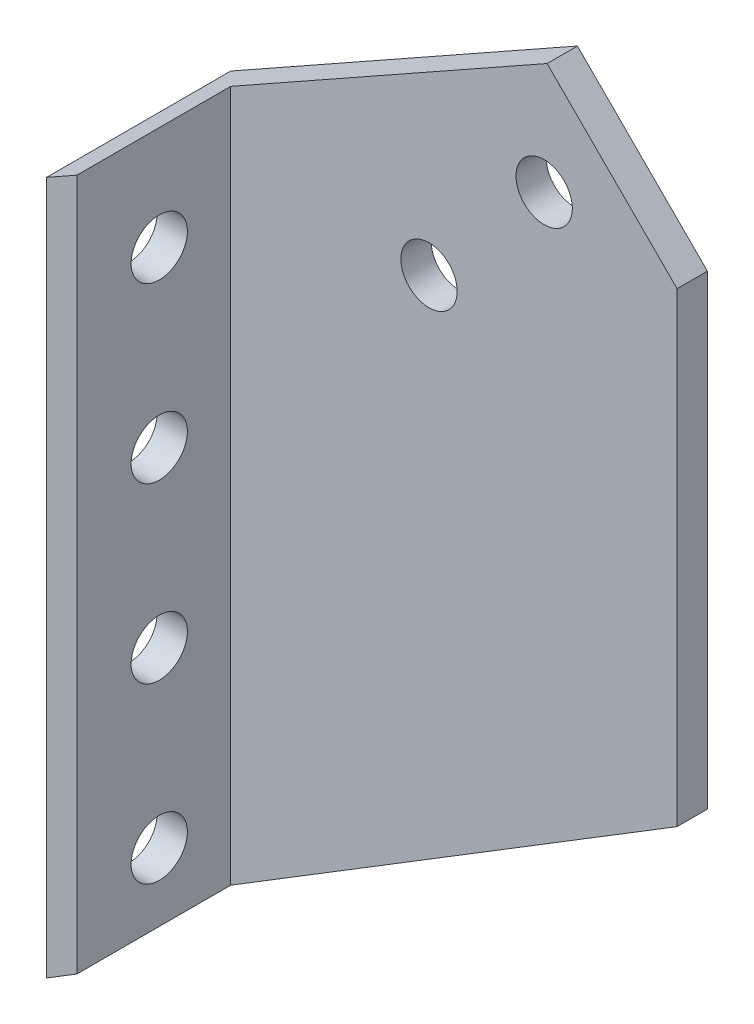
ISO-10303-21;
HEADER;
FILE_DESCRIPTION(('STEP AP214'),'2;1');
FILE_NAME('part.step','',(''),(''),'','','');
FILE_SCHEMA(('AUTOMOTIVE_DESIGN { 1 0 10303 214 1 1 1 1 }'));
ENDSEC;
DATA;
#1=APPLICATION_CONTEXT('core data for automotive mechanical design processes');
#2=APPLICATION_PROTOCOL_DEFINITION('international standard','automotive_design',2000,#1);
#3=PRODUCT_CONTEXT('',#1,'mechanical');
#4=PRODUCT('Part','Part','',(#3));
#5=PRODUCT_RELATED_PRODUCT_CATEGORY('part','',(#4));
#6=PRODUCT_DEFINITION_FORMATION('','',#4);
#7=PRODUCT_DEFINITION_CONTEXT('part definition',#1,'design');
#8=PRODUCT_DEFINITION('design','',#6,#7);
#9=PRODUCT_DEFINITION_SHAPE('','',#8);
#10=(LENGTH_UNIT() NAMED_UNIT(*) SI_UNIT(.MILLI.,.METRE.));
#11=(NAMED_UNIT(*) PLANE_ANGLE_UNIT() SI_UNIT($,.RADIAN.));
#12=(NAMED_UNIT(*) SI_UNIT($,.STERADIAN.) SOLID_ANGLE_UNIT());
#13=UNCERTAINTY_MEASURE_WITH_UNIT(LENGTH_MEASURE(1.E-05),#10,'distance_accuracy_value','');
#14=(GEOMETRIC_REPRESENTATION_CONTEXT(3) GLOBAL_UNCERTAINTY_ASSIGNED_CONTEXT((#13)) GLOBAL_UNIT_ASSIGNED_CONTEXT((#10,
#11,#12)) REPRESENTATION_CONTEXT('',''));
#15=CARTESIAN_POINT('',(0.,0.,0.));
#16=DIRECTION('',(0.,0.,1.));
#17=DIRECTION('',(1.,0.,0.));
#18=AXIS2_PLACEMENT_3D('',#15,#16,#17);
#19=CARTESIAN_POINT('',(233.582996255987,153.383897007896,14.));
#20=DIRECTION('',(0.,0.,1.));
#21=DIRECTION('',(1.,0.,0.));
#22=AXIS2_PLACEMENT_3D('',#19,#20,#21);
#23=PLANE('',#22);
#24=DIRECTION('',(0.,1.,0.));
#25=VECTOR('',#24,1.);
#26=CARTESIAN_POINT('',(-105.656440363729,264.498333627615,14.));
#27=LINE('',#26,#25);
#28=CARTESIAN_POINT('',(-105.656440363729,-54.7857572814754,14.));
#29=VERTEX_POINT('',#28);
#30=CARTESIAN_POINT('',(-105.656440363729,264.498333627615,14.));
#31=VERTEX_POINT('',#30);
#32=EDGE_CURVE('E51',#29,#31,#27,.T.);
#33=ORIENTED_EDGE('',*,*,#32,.F.);
#34=DIRECTION('',(0.852322728648666,0.52301621985259,0.));
#35=VECTOR('',#34,1.);
#36=CARTESIAN_POINT('',(-119.656440363729,-63.3766663723846,14.));
#37=LINE('',#36,#35);
#38=CARTESIAN_POINT('',(100.343559636271,71.6233336276154,14.));
#39=VERTEX_POINT('',#38);
#40=EDGE_CURVE('E84',#29,#39,#37,.T.);
#41=ORIENTED_EDGE('',*,*,#40,.T.);
#42=DIRECTION('',(0.,1.,0.));
#43=VECTOR('',#42,1.);
#44=CARTESIAN_POINT('',(100.343559636271,71.6233336276154,14.));
#45=LINE('',#44,#43);
#46=CARTESIAN_POINT('',(100.343559636271,286.623333627615,14.));
#47=VERTEX_POINT('',#46);
#48=EDGE_CURVE('E201',#39,#47,#45,.T.);
#49=ORIENTED_EDGE('',*,*,#48,.T.);
#50=DIRECTION('',(-0.70710678118654,0.707106781186555,0.));
#51=VECTOR('',#50,1.);
#52=CARTESIAN_POINT('',(100.343559636271,286.623333627615,14.));
#53=LINE('',#52,#51);
#54=CARTESIAN_POINT('',(40.3435596362774,346.62333362761,14.));
#55=VERTEX_POINT('',#54);
#56=EDGE_CURVE('E58',#47,#55,#53,.T.);
#57=ORIENTED_EDGE('',*,*,#56,.T.);
#58=DIRECTION('',(-0.87157553712457,-0.490261239632521,0.));
#59=VECTOR('',#58,1.);
#60=CARTESIAN_POINT('',(40.3435596362774,346.62333362761,14.));
#61=LINE('',#60,#59);
#62=EDGE_CURVE('E139',#55,#31,#61,.T.);
#63=ORIENTED_EDGE('',*,*,#62,.T.);
#64=EDGE_LOOP('',(#33,#41,#49,#57,#63));
#65=FACE_BOUND('',#64,.T.);
#66=CARTESIAN_POINT('',(-14.1564403637289,234.748333627631,14.));
#67=DIRECTION('',(0.,0.,1.));
#68=DIRECTION('',(1.,0.,0.));
#69=AXIS2_PLACEMENT_3D('',#66,#67,#68);
#70=CIRCLE('',#69,13.);
#71=CARTESIAN_POINT('',(-1.15644036372886,234.748333627631,14.));
#72=VERTEX_POINT('',#71);
#73=EDGE_CURVE('E211',#72,#72,#70,.T.);
#74=ORIENTED_EDGE('',*,*,#73,.F.);
#75=EDGE_LOOP('',(#74));
#76=FACE_BOUND('',#75,.T.);
#77=CARTESIAN_POINT('',(38.9926667426649,294.541079122324,14.));
#78=DIRECTION('',(0.,0.,1.));
#79=DIRECTION('',(1.,0.,0.));
#80=AXIS2_PLACEMENT_3D('',#77,#78,#79);
#81=CIRCLE('',#80,13.);
#82=CARTESIAN_POINT('',(51.9926667426649,294.541079122324,14.));
#83=VERTEX_POINT('',#82);
#84=EDGE_CURVE('E135',#83,#83,#81,.T.);
#85=ORIENTED_EDGE('',*,*,#84,.F.);
#86=EDGE_LOOP('',(#85));
#87=FACE_BOUND('',#86,.T.);
#88=ADVANCED_FACE('F34',(#65,#76,#87),#23,.T.);
#89=CARTESIAN_POINT('',(233.582996255987,153.383897007896,0.));
#90=DIRECTION('',(0.,0.,1.));
#91=DIRECTION('',(1.,0.,0.));
#92=AXIS2_PLACEMENT_3D('',#89,#90,#91);
#93=PLANE('',#92);
#94=CARTESIAN_POINT('',(-14.1564403637289,234.748333627631,0.));
#95=DIRECTION('',(0.,0.,1.));
#96=DIRECTION('',(1.,0.,0.));
#97=AXIS2_PLACEMENT_3D('',#94,#95,#96);
#98=CIRCLE('',#97,13.);
#99=CARTESIAN_POINT('',(-1.15644036372886,234.748333627631,0.));
#100=VERTEX_POINT('',#99);
#101=EDGE_CURVE('E221',#100,#100,#98,.T.);
#102=ORIENTED_EDGE('',*,*,#101,.T.);
#103=EDGE_LOOP('',(#102));
#104=FACE_BOUND('',#103,.T.);
#105=DIRECTION('',(0.852322728648666,0.52301621985259,0.));
#106=VECTOR('',#105,1.);
#107=CARTESIAN_POINT('',(-119.656440363729,-63.3766663723846,0.));
#108=LINE('',#107,#106);
#109=CARTESIAN_POINT('',(-119.656440363729,-63.3766663723846,0.));
#110=VERTEX_POINT('',#109);
#111=CARTESIAN_POINT('',(100.343559636271,71.6233336276154,0.));
#112=VERTEX_POINT('',#111);
#113=EDGE_CURVE('E207',#110,#112,#108,.T.);
#114=ORIENTED_EDGE('',*,*,#113,.F.);
#115=DIRECTION('',(0.,-1.,0.));
#116=VECTOR('',#115,1.);
#117=CARTESIAN_POINT('',(-119.656440363729,-63.3766663723846,0.));
#118=LINE('',#117,#116);
#119=CARTESIAN_POINT('',(-119.656440363729,256.623333627615,0.));
#120=VERTEX_POINT('',#119);
#121=EDGE_CURVE('E82',#120,#110,#118,.T.);
#122=ORIENTED_EDGE('',*,*,#121,.F.);
#123=DIRECTION('',(-0.87157553712457,-0.490261239632521,0.));
#124=VECTOR('',#123,1.);
#125=CARTESIAN_POINT('',(40.3435596362774,346.62333362761,0.));
#126=LINE('',#125,#124);
#127=CARTESIAN_POINT('',(40.3435596362774,346.62333362761,0.));
#128=VERTEX_POINT('',#127);
#129=EDGE_CURVE('E108',#128,#120,#126,.T.);
#130=ORIENTED_EDGE('',*,*,#129,.F.);
#131=DIRECTION('',(-0.70710678118654,0.707106781186555,0.));
#132=VECTOR('',#131,1.);
#133=CARTESIAN_POINT('',(100.343559636271,286.623333627615,0.));
#134=LINE('',#133,#132);
#135=CARTESIAN_POINT('',(100.343559636271,286.623333627615,0.));
#136=VERTEX_POINT('',#135);
#137=EDGE_CURVE('E213',#136,#128,#134,.T.);
#138=ORIENTED_EDGE('',*,*,#137,.F.);
#139=DIRECTION('',(0.,1.,0.));
#140=VECTOR('',#139,1.);
#141=CARTESIAN_POINT('',(100.343559636271,71.6233336276154,0.));
#142=LINE('',#141,#140);
#143=EDGE_CURVE('E210',#112,#136,#142,.T.);
#144=ORIENTED_EDGE('',*,*,#143,.F.);
#145=EDGE_LOOP('',(#114,#122,#130,#138,#144));
#146=FACE_BOUND('',#145,.T.);
#147=CARTESIAN_POINT('',(38.9926667426649,294.541079122324,0.));
#148=DIRECTION('',(0.,0.,1.));
#149=DIRECTION('',(1.,0.,0.));
#150=AXIS2_PLACEMENT_3D('',#147,#148,#149);
#151=CIRCLE('',#150,13.);
#152=CARTESIAN_POINT('',(51.9926667426649,294.541079122324,0.));
#153=VERTEX_POINT('',#152);
#154=EDGE_CURVE('E148',#153,#153,#151,.T.);
#155=ORIENTED_EDGE('',*,*,#154,.T.);
#156=EDGE_LOOP('',(#155));
#157=FACE_BOUND('',#156,.T.);
#158=ADVANCED_FACE('F234',(#104,#146,#157),#93,.F.);
#159=CARTESIAN_POINT('',(-119.656440363729,-63.3766663723846,14.));
#160=DIRECTION('',(-0.52301621985259,0.852322728648666,0.));
#161=DIRECTION('',(-0.852322728648666,-0.52301621985259,0.));
#162=AXIS2_PLACEMENT_3D('',#159,#160,#161);
#163=PLANE('',#162);
#164=ORIENTED_EDGE('',*,*,#113,.T.);
#165=DIRECTION('',(0.,0.,-1.));
#166=VECTOR('',#165,1.);
#167=CARTESIAN_POINT('',(100.343559636271,71.6233336276154,14.));
#168=LINE('',#167,#166);
#169=EDGE_CURVE('E11',#39,#112,#168,.T.);
#170=ORIENTED_EDGE('',*,*,#169,.F.);
#171=ORIENTED_EDGE('',*,*,#40,.F.);
#172=DIRECTION('',(0.,0.,-1.));
#173=VECTOR('',#172,1.);
#174=CARTESIAN_POINT('',(-105.656440363729,-54.7857572814754,85.));
#175=LINE('',#174,#173);
#176=CARTESIAN_POINT('',(-105.656440363729,-54.7857572814754,85.));
#177=VERTEX_POINT('',#176);
#178=EDGE_CURVE('E143',#177,#29,#175,.T.);
#179=ORIENTED_EDGE('',*,*,#178,.F.);
#180=DIRECTION('',(0.852322728648666,0.52301621985259,0.));
#181=VECTOR('',#180,1.);
#182=CARTESIAN_POINT('',(-119.656440363729,-63.3766663723846,85.));
#183=LINE('',#182,#181);
#184=CARTESIAN_POINT('',(-119.656440363729,-63.3766663723846,85.));
#185=VERTEX_POINT('',#184);
#186=EDGE_CURVE('E117',#185,#177,#183,.T.);
#187=ORIENTED_EDGE('',*,*,#186,.F.);
#188=DIRECTION('',(0.,0.,-1.));
#189=VECTOR('',#188,1.);
#190=CARTESIAN_POINT('',(-119.656440363729,-63.3766663723846,14.));
#191=LINE('',#190,#189);
#192=EDGE_CURVE('E110',#185,#110,#191,.T.);
#193=ORIENTED_EDGE('',*,*,#192,.T.);
#194=EDGE_LOOP('',(#164,#170,#171,#179,#187,#193));
#195=FACE_BOUND('',#194,.T.);
#196=ADVANCED_FACE('F36',(#195),#163,.F.);
#197=CARTESIAN_POINT('',(100.343559636271,71.6233336276154,14.));
#198=DIRECTION('',(-1.,0.,0.));
#199=DIRECTION('',(0.,0.,1.));
#200=AXIS2_PLACEMENT_3D('',#197,#198,#199);
#201=PLANE('',#200);
#202=ORIENTED_EDGE('',*,*,#143,.T.);
#203=DIRECTION('',(0.,0.,-1.));
#204=VECTOR('',#203,1.);
#205=CARTESIAN_POINT('',(100.343559636271,286.623333627615,14.));
#206=LINE('',#205,#204);
#207=EDGE_CURVE('E43',#47,#136,#206,.T.);
#208=ORIENTED_EDGE('',*,*,#207,.F.);
#209=ORIENTED_EDGE('',*,*,#48,.F.);
#210=ORIENTED_EDGE('',*,*,#169,.T.);
#211=EDGE_LOOP('',(#202,#208,#209,#210));
#212=FACE_BOUND('',#211,.T.);
#213=ADVANCED_FACE('F249',(#212),#201,.F.);
#214=CARTESIAN_POINT('',(100.343559636271,286.623333627615,14.));
#215=DIRECTION('',(-0.707106781186555,-0.70710678118654,0.));
#216=DIRECTION('',(0.70710678118654,-0.707106781186555,0.));
#217=AXIS2_PLACEMENT_3D('',#214,#215,#216);
#218=PLANE('',#217);
#219=ORIENTED_EDGE('',*,*,#137,.T.);
#220=DIRECTION('',(0.,0.,-1.));
#221=VECTOR('',#220,1.);
#222=CARTESIAN_POINT('',(40.3435596362774,346.62333362761,14.));
#223=LINE('',#222,#221);
#224=EDGE_CURVE('E109',#55,#128,#223,.T.);
#225=ORIENTED_EDGE('',*,*,#224,.F.);
#226=ORIENTED_EDGE('',*,*,#56,.F.);
#227=ORIENTED_EDGE('',*,*,#207,.T.);
#228=EDGE_LOOP('',(#219,#225,#226,#227));
#229=FACE_BOUND('',#228,.T.);
#230=ADVANCED_FACE('F247',(#229),#218,.F.);
#231=CARTESIAN_POINT('',(40.3435596362774,346.62333362761,14.));
#232=DIRECTION('',(0.490261239632521,-0.87157553712457,0.));
#233=DIRECTION('',(0.87157553712457,0.490261239632521,0.));
#234=AXIS2_PLACEMENT_3D('',#231,#232,#233);
#235=PLANE('',#234);
#236=ORIENTED_EDGE('',*,*,#129,.T.);
#237=DIRECTION('',(0.,0.,-1.));
#238=VECTOR('',#237,1.);
#239=CARTESIAN_POINT('',(-119.656440363729,256.623333627615,14.));
#240=LINE('',#239,#238);
#241=CARTESIAN_POINT('',(-119.656440363729,256.623333627615,85.));
#242=VERTEX_POINT('',#241);
#243=EDGE_CURVE('E100',#242,#120,#240,.T.);
#244=ORIENTED_EDGE('',*,*,#243,.F.);
#245=DIRECTION('',(-0.871575537124571,-0.490261239632521,0.));
#246=VECTOR('',#245,1.);
#247=CARTESIAN_POINT('',(-105.656440363729,264.498333627615,85.));
#248=LINE('',#247,#246);
#249=CARTESIAN_POINT('',(-105.656440363729,264.498333627615,85.));
#250=VERTEX_POINT('',#249);
#251=EDGE_CURVE('E105',#250,#242,#248,.T.);
#252=ORIENTED_EDGE('',*,*,#251,.F.);
#253=DIRECTION('',(0.,0.,-1.));
#254=VECTOR('',#253,1.);
#255=CARTESIAN_POINT('',(-105.656440363729,264.498333627615,85.));
#256=LINE('',#255,#254);
#257=EDGE_CURVE('E132',#250,#31,#256,.T.);
#258=ORIENTED_EDGE('',*,*,#257,.T.);
#259=ORIENTED_EDGE('',*,*,#62,.F.);
#260=ORIENTED_EDGE('',*,*,#224,.T.);
#261=EDGE_LOOP('',(#236,#244,#252,#258,#259,#260));
#262=FACE_BOUND('',#261,.T.);
#263=ADVANCED_FACE('F102',(#262),#235,.F.);
#264=CARTESIAN_POINT('',(-119.656440363729,-63.3766663723846,14.));
#265=DIRECTION('',(1.,0.,0.));
#266=DIRECTION('',(0.,1.,0.));
#267=AXIS2_PLACEMENT_3D('',#264,#265,#266);
#268=PLANE('',#267);
#269=CARTESIAN_POINT('',(-119.656440363729,-23.3766663723845,47.));
#270=DIRECTION('',(-1.,0.,0.));
#271=DIRECTION('',(0.,-1.,0.));
#272=AXIS2_PLACEMENT_3D('',#269,#270,#271);
#273=CIRCLE('',#272,13.);
#274=CARTESIAN_POINT('',(-119.656440363729,-36.3766663723845,47.));
#275=VERTEX_POINT('',#274);
#276=EDGE_CURVE('E167',#275,#275,#273,.T.);
#277=ORIENTED_EDGE('',*,*,#276,.F.);
#278=EDGE_LOOP('',(#277));
#279=FACE_BOUND('',#278,.T.);
#280=CARTESIAN_POINT('',(-119.656440363729,56.6233336276155,47.));
#281=DIRECTION('',(-1.,0.,0.));
#282=DIRECTION('',(0.,-1.,0.));
#283=AXIS2_PLACEMENT_3D('',#280,#281,#282);
#284=CIRCLE('',#283,13.);
#285=CARTESIAN_POINT('',(-119.656440363729,43.6233336276155,47.));
#286=VERTEX_POINT('',#285);
#287=EDGE_CURVE('E158',#286,#286,#284,.T.);
#288=ORIENTED_EDGE('',*,*,#287,.F.);
#289=EDGE_LOOP('',(#288));
#290=FACE_BOUND('',#289,.T.);
#291=CARTESIAN_POINT('',(-119.656440363729,136.623333627615,47.));
#292=DIRECTION('',(-1.,0.,0.));
#293=DIRECTION('',(0.,-1.,0.));
#294=AXIS2_PLACEMENT_3D('',#291,#292,#293);
#295=CIRCLE('',#294,13.);
#296=CARTESIAN_POINT('',(-119.656440363729,123.623333627615,47.));
#297=VERTEX_POINT('',#296);
#298=EDGE_CURVE('E155',#297,#297,#295,.T.);
#299=ORIENTED_EDGE('',*,*,#298,.F.);
#300=EDGE_LOOP('',(#299));
#301=FACE_BOUND('',#300,.T.);
#302=CARTESIAN_POINT('',(-119.656440363729,216.623333627615,47.));
#303=DIRECTION('',(-1.,0.,0.));
#304=DIRECTION('',(0.,-1.,0.));
#305=AXIS2_PLACEMENT_3D('',#302,#303,#304);
#306=CIRCLE('',#305,13.);
#307=CARTESIAN_POINT('',(-119.656440363729,203.623333627615,47.));
#308=VERTEX_POINT('',#307);
#309=EDGE_CURVE('E127',#308,#308,#306,.T.);
#310=ORIENTED_EDGE('',*,*,#309,.F.);
#311=EDGE_LOOP('',(#310));
#312=FACE_BOUND('',#311,.T.);
#313=ORIENTED_EDGE('',*,*,#121,.T.);
#314=ORIENTED_EDGE('',*,*,#192,.F.);
#315=DIRECTION('',(0.,-1.,0.));
#316=VECTOR('',#315,1.);
#317=CARTESIAN_POINT('',(-119.656440363729,256.623333627615,85.));
#318=LINE('',#317,#316);
#319=EDGE_CURVE('E113',#242,#185,#318,.T.);
#320=ORIENTED_EDGE('',*,*,#319,.F.);
#321=ORIENTED_EDGE('',*,*,#243,.T.);
#322=EDGE_LOOP('',(#313,#314,#320,#321));
#323=FACE_BOUND('',#322,.T.);
#324=ADVANCED_FACE('F114',(#279,#290,#301,#312,#323),#268,.F.);
#325=CARTESIAN_POINT('',(-14.1564403637289,234.748333627631,14.));
#326=DIRECTION('',(0.,0.,-1.));
#327=DIRECTION('',(-1.,0.,0.));
#328=AXIS2_PLACEMENT_3D('',#325,#326,#327);
#329=CYLINDRICAL_SURFACE('',#328,13.);
#330=ORIENTED_EDGE('',*,*,#73,.T.);
#331=EDGE_LOOP('',(#330));
#332=FACE_BOUND('',#331,.T.);
#333=ORIENTED_EDGE('',*,*,#101,.F.);
#334=EDGE_LOOP('',(#333));
#335=FACE_BOUND('',#334,.T.);
#336=ADVANCED_FACE('F177',(#332,#335),#329,.F.);
#337=CARTESIAN_POINT('',(38.9926667426649,294.541079122324,14.));
#338=DIRECTION('',(0.,0.,-1.));
#339=DIRECTION('',(-1.,0.,0.));
#340=AXIS2_PLACEMENT_3D('',#337,#338,#339);
#341=CYLINDRICAL_SURFACE('',#340,13.);
#342=ORIENTED_EDGE('',*,*,#84,.T.);
#343=EDGE_LOOP('',(#342));
#344=FACE_BOUND('',#343,.T.);
#345=ORIENTED_EDGE('',*,*,#154,.F.);
#346=EDGE_LOOP('',(#345));
#347=FACE_BOUND('',#346,.T.);
#348=ADVANCED_FACE('F195',(#344,#347),#341,.F.);
#349=CARTESIAN_POINT('',(-105.656440363729,264.498333627615,85.));
#350=DIRECTION('',(-1.,0.,0.));
#351=DIRECTION('',(0.,-1.,0.));
#352=AXIS2_PLACEMENT_3D('',#349,#350,#351);
#353=PLANE('',#352);
#354=CARTESIAN_POINT('',(-105.656440363729,-23.3766663723845,47.));
#355=DIRECTION('',(-1.,0.,0.));
#356=DIRECTION('',(0.,-1.,0.));
#357=AXIS2_PLACEMENT_3D('',#354,#355,#356);
#358=CIRCLE('',#357,13.);
#359=CARTESIAN_POINT('',(-105.656440363729,-36.3766663723845,47.));
#360=VERTEX_POINT('',#359);
#361=EDGE_CURVE('E38',#360,#360,#358,.T.);
#362=ORIENTED_EDGE('',*,*,#361,.T.);
#363=EDGE_LOOP('',(#362));
#364=FACE_BOUND('',#363,.T.);
#365=CARTESIAN_POINT('',(-105.656440363729,56.6233336276155,47.));
#366=DIRECTION('',(-1.,0.,0.));
#367=DIRECTION('',(0.,-1.,0.));
#368=AXIS2_PLACEMENT_3D('',#365,#366,#367);
#369=CIRCLE('',#368,13.);
#370=CARTESIAN_POINT('',(-105.656440363729,43.6233336276155,47.));
#371=VERTEX_POINT('',#370);
#372=EDGE_CURVE('E156',#371,#371,#369,.T.);
#373=ORIENTED_EDGE('',*,*,#372,.T.);
#374=EDGE_LOOP('',(#373));
#375=FACE_BOUND('',#374,.T.);
#376=CARTESIAN_POINT('',(-105.656440363729,136.623333627615,47.));
#377=DIRECTION('',(-1.,0.,0.));
#378=DIRECTION('',(0.,-1.,0.));
#379=AXIS2_PLACEMENT_3D('',#376,#377,#378);
#380=CIRCLE('',#379,13.);
#381=CARTESIAN_POINT('',(-105.656440363729,123.623333627615,47.));
#382=VERTEX_POINT('',#381);
#383=EDGE_CURVE('E153',#382,#382,#380,.T.);
#384=ORIENTED_EDGE('',*,*,#383,.T.);
#385=EDGE_LOOP('',(#384));
#386=FACE_BOUND('',#385,.T.);
#387=CARTESIAN_POINT('',(-105.656440363729,216.623333627615,47.));
#388=DIRECTION('',(-1.,0.,0.));
#389=DIRECTION('',(0.,-1.,0.));
#390=AXIS2_PLACEMENT_3D('',#387,#388,#389);
#391=CIRCLE('',#390,13.);
#392=CARTESIAN_POINT('',(-105.656440363729,203.623333627615,47.));
#393=VERTEX_POINT('',#392);
#394=EDGE_CURVE('E124',#393,#393,#391,.T.);
#395=ORIENTED_EDGE('',*,*,#394,.T.);
#396=EDGE_LOOP('',(#395));
#397=FACE_BOUND('',#396,.T.);
#398=ORIENTED_EDGE('',*,*,#32,.T.);
#399=ORIENTED_EDGE('',*,*,#257,.F.);
#400=DIRECTION('',(0.,1.,0.));
#401=VECTOR('',#400,1.);
#402=CARTESIAN_POINT('',(-105.656440363729,264.498333627615,85.));
#403=LINE('',#402,#401);
#404=EDGE_CURVE('E121',#177,#250,#403,.T.);
#405=ORIENTED_EDGE('',*,*,#404,.F.);
#406=ORIENTED_EDGE('',*,*,#178,.T.);
#407=EDGE_LOOP('',(#398,#399,#405,#406));
#408=FACE_BOUND('',#407,.T.);
#409=ADVANCED_FACE('F192',(#364,#375,#386,#397,#408),#353,.F.);
#410=CARTESIAN_POINT('',(-119.656440363729,256.623333627615,85.));
#411=DIRECTION('',(0.,0.,1.));
#412=DIRECTION('',(1.,0.,0.));
#413=AXIS2_PLACEMENT_3D('',#410,#411,#412);
#414=PLANE('',#413);
#415=ORIENTED_EDGE('',*,*,#251,.T.);
#416=ORIENTED_EDGE('',*,*,#319,.T.);
#417=ORIENTED_EDGE('',*,*,#186,.T.);
#418=ORIENTED_EDGE('',*,*,#404,.T.);
#419=EDGE_LOOP('',(#415,#416,#417,#418));
#420=FACE_BOUND('',#419,.T.);
#421=ADVANCED_FACE('F119',(#420),#414,.T.);
#422=CARTESIAN_POINT('',(100.343584636271,216.623333627615,47.));
#423=DIRECTION('',(-1.,0.,0.));
#424=DIRECTION('',(0.,-1.,0.));
#425=AXIS2_PLACEMENT_3D('',#422,#423,#424);
#426=CYLINDRICAL_SURFACE('',#425,13.);
#427=ORIENTED_EDGE('',*,*,#309,.T.);
#428=EDGE_LOOP('',(#427));
#429=FACE_BOUND('',#428,.T.);
#430=ORIENTED_EDGE('',*,*,#394,.F.);
#431=EDGE_LOOP('',(#430));
#432=FACE_BOUND('',#431,.T.);
#433=ADVANCED_FACE('F185',(#429,#432),#426,.F.);
#434=CARTESIAN_POINT('',(100.343584636271,136.623333627615,47.));
#435=DIRECTION('',(-1.,0.,0.));
#436=DIRECTION('',(0.,-1.,0.));
#437=AXIS2_PLACEMENT_3D('',#434,#435,#436);
#438=CYLINDRICAL_SURFACE('',#437,13.);
#439=ORIENTED_EDGE('',*,*,#298,.T.);
#440=EDGE_LOOP('',(#439));
#441=FACE_BOUND('',#440,.T.);
#442=ORIENTED_EDGE('',*,*,#383,.F.);
#443=EDGE_LOOP('',(#442));
#444=FACE_BOUND('',#443,.T.);
#445=ADVANCED_FACE('F188',(#441,#444),#438,.F.);
#446=CARTESIAN_POINT('',(100.343584636271,56.6233336276154,47.));
#447=DIRECTION('',(-1.,0.,0.));
#448=DIRECTION('',(0.,-1.,0.));
#449=AXIS2_PLACEMENT_3D('',#446,#447,#448);
#450=CYLINDRICAL_SURFACE('',#449,13.);
#451=CARTESIAN_POINT('',(-119.656440363729,43.6233336276155,47.));
#452=CARTESIAN_POINT('',(-119.510607030396,43.6233336276155,47.));
#453=CARTESIAN_POINT('',(-119.364773697063,43.6233336276155,47.));
#454=CARTESIAN_POINT('',(-119.073107030396,43.6233336276155,47.));
#455=CARTESIAN_POINT('',(-118.927273697063,43.6233336276155,47.));
#456=CARTESIAN_POINT('',(-118.635607030396,43.6233336276155,47.));
#457=CARTESIAN_POINT('',(-118.489773697063,43.6233336276155,47.));
#458=CARTESIAN_POINT('',(-118.198107030396,43.6233336276155,47.));
#459=CARTESIAN_POINT('',(-118.052273697063,43.6233336276155,47.));
#460=CARTESIAN_POINT('',(-117.760607030396,43.6233336276155,47.));
#461=CARTESIAN_POINT('',(-117.614773697063,43.6233336276155,47.));
#462=CARTESIAN_POINT('',(-117.323107030396,43.6233336276155,47.));
#463=CARTESIAN_POINT('',(-117.177273697063,43.6233336276155,47.));
#464=CARTESIAN_POINT('',(-116.885607030396,43.6233336276155,47.));
#465=CARTESIAN_POINT('',(-116.739773697063,43.6233336276155,47.));
#466=CARTESIAN_POINT('',(-116.448107030396,43.6233336276155,47.));
#467=CARTESIAN_POINT('',(-116.302273697063,43.6233336276155,47.));
#468=CARTESIAN_POINT('',(-116.010607030396,43.6233336276155,47.));
#469=CARTESIAN_POINT('',(-115.864773697063,43.6233336276155,47.));
#470=CARTESIAN_POINT('',(-115.573107030396,43.6233336276155,47.));
#471=CARTESIAN_POINT('',(-115.427273697063,43.6233336276155,47.));
#472=CARTESIAN_POINT('',(-115.135607030396,43.6233336276155,47.));
#473=CARTESIAN_POINT('',(-114.989773697063,43.6233336276155,47.));
#474=CARTESIAN_POINT('',(-114.698107030396,43.6233336276155,47.));
#475=CARTESIAN_POINT('',(-114.552273697063,43.6233336276155,47.));
#476=CARTESIAN_POINT('',(-114.260607030396,43.6233336276155,47.));
#477=CARTESIAN_POINT('',(-114.114773697063,43.6233336276155,47.));
#478=CARTESIAN_POINT('',(-113.823107030396,43.6233336276155,47.));
#479=CARTESIAN_POINT('',(-113.677273697063,43.6233336276155,47.));
#480=CARTESIAN_POINT('',(-113.385607030396,43.6233336276155,47.));
#481=CARTESIAN_POINT('',(-113.239773697063,43.6233336276155,47.));
#482=CARTESIAN_POINT('',(-112.948107030396,43.6233336276155,47.));
#483=CARTESIAN_POINT('',(-112.802273697063,43.6233336276155,47.));
#484=CARTESIAN_POINT('',(-112.510607030396,43.6233336276155,47.));
#485=CARTESIAN_POINT('',(-112.364773697063,43.6233336276155,47.));
#486=CARTESIAN_POINT('',(-112.073107030396,43.6233336276155,47.));
#487=CARTESIAN_POINT('',(-111.927273697063,43.6233336276155,47.));
#488=CARTESIAN_POINT('',(-111.635607030396,43.6233336276155,47.));
#489=CARTESIAN_POINT('',(-111.489773697063,43.6233336276155,47.));
#490=CARTESIAN_POINT('',(-111.198107030396,43.6233336276155,47.));
#491=CARTESIAN_POINT('',(-111.052273697063,43.6233336276155,47.));
#492=CARTESIAN_POINT('',(-110.760607030396,43.6233336276155,47.));
#493=CARTESIAN_POINT('',(-110.614773697063,43.6233336276155,47.));
#494=CARTESIAN_POINT('',(-110.323107030396,43.6233336276155,47.));
#495=CARTESIAN_POINT('',(-110.177273697063,43.6233336276155,47.));
#496=CARTESIAN_POINT('',(-109.885607030396,43.6233336276155,47.));
#497=CARTESIAN_POINT('',(-109.739773697062,43.6233336276155,47.));
#498=CARTESIAN_POINT('',(-109.448107030396,43.6233336276155,47.));
#499=CARTESIAN_POINT('',(-109.302273697062,43.6233336276155,47.));
#500=CARTESIAN_POINT('',(-109.010607030396,43.6233336276155,47.));
#501=CARTESIAN_POINT('',(-108.864773697063,43.6233336276155,47.));
#502=CARTESIAN_POINT('',(-108.573107030396,43.6233336276155,47.));
#503=CARTESIAN_POINT('',(-108.427273697062,43.6233336276155,47.));
#504=CARTESIAN_POINT('',(-108.135607030396,43.6233336276155,47.));
#505=CARTESIAN_POINT('',(-107.989773697062,43.6233336276155,47.));
#506=CARTESIAN_POINT('',(-107.698107030396,43.6233336276155,47.));
#507=CARTESIAN_POINT('',(-107.552273697062,43.6233336276155,47.));
#508=CARTESIAN_POINT('',(-107.260607030396,43.6233336276155,47.));
#509=CARTESIAN_POINT('',(-107.114773697062,43.6233336276155,47.));
#510=CARTESIAN_POINT('',(-106.823107030396,43.6233336276155,47.));
#511=CARTESIAN_POINT('',(-106.677273697062,43.6233336276155,47.));
#512=CARTESIAN_POINT('',(-106.385607030396,43.6233336276155,47.));
#513=CARTESIAN_POINT('',(-106.239773697062,43.6233336276155,47.));
#514=CARTESIAN_POINT('',(-105.948107030396,43.6233336276155,47.));
#515=CARTESIAN_POINT('',(-105.802273697062,43.6233336276155,47.));
#516=CARTESIAN_POINT('',(-105.656440363729,43.6233336276155,47.));
#517=B_SPLINE_CURVE_WITH_KNOTS('',3,(#451,#452,#453,#454,#455,#456,#457,#458,#459,#460,#461,
#462,#463,#464,#465,#466,#467,#468,#469,#470,#471,#472,#473,#474,#475,#476,#477,#478,#479,#480,
#481,#482,#483,#484,#485,#486,#487,#488,#489,#490,#491,#492,#493,#494,#495,#496,#497,#498,#499,
#500,#501,#502,#503,#504,#505,#506,#507,#508,#509,#510,#511,#512,#513,#514,#515,#516),
.UNSPECIFIED.,.F.,.F.,(4,2,2,2,2,2,2,2,2,2,2,2,2,2,2,2,2,2,2,2,2,2,2,2,2,2,2,2,2,2,2,2,4),(0.,
0.437500000000007,0.875000000000015,1.31249999999999,1.75,2.18750000000001,2.62500000000002,
3.06250000000002,3.5,3.93750000000001,4.37500000000002,4.81250000000002,5.25000000000003,
5.68750000000004,6.12500000000002,6.56250000000003,7.00000000000003,7.43750000000004,
7.87500000000005,8.31250000000003,8.75000000000004,9.18750000000004,9.62500000000005,
10.0625000000001,10.5000000000001,10.9375,11.3750000000001,11.8125000000001,12.2500000000001,
12.6875000000001,13.1250000000001,13.5625000000001,14.0000000000001),.UNSPECIFIED.);
#518=EDGE_CURVE('BSEAM324',#286,#371,#517,.T.);
#519=ORIENTED_EDGE('',*,*,#287,.T.);
#520=ORIENTED_EDGE('',*,*,#372,.F.);
#521=ORIENTED_EDGE('',*,*,#518,.T.);
#522=ORIENTED_EDGE('',*,*,#518,.F.);
#523=EDGE_LOOP('',(#519,#521,#520,#522));
#524=FACE_BOUND('',#523,.T.);
#525=ADVANCED_FACE('F324',(#524),#450,.F.);
#526=CARTESIAN_POINT('',(100.343584636271,-23.3766663723845,47.));
#527=DIRECTION('',(-1.,0.,0.));
#528=DIRECTION('',(0.,-1.,0.));
#529=AXIS2_PLACEMENT_3D('',#526,#527,#528);
#530=CYLINDRICAL_SURFACE('',#529,13.);
#531=ORIENTED_EDGE('',*,*,#276,.T.);
#532=EDGE_LOOP('',(#531));
#533=FACE_BOUND('',#532,.T.);
#534=ORIENTED_EDGE('',*,*,#361,.F.);
#535=EDGE_LOOP('',(#534));
#536=FACE_BOUND('',#535,.T.);
#537=ADVANCED_FACE('F172',(#533,#536),#530,.F.);
#538=CLOSED_SHELL('',(#88,#158,#196,#213,#230,#263,#324,#336,#348,#409,#421,#433,#445,#525,#537));
#539=MANIFOLD_SOLID_BREP('B2',#538);
#540=ADVANCED_BREP_SHAPE_REPRESENTATION('',(#18,#539),#14);
#541=SHAPE_DEFINITION_REPRESENTATION(#9,#540);
ENDSEC;
END-ISO-10303-21;
